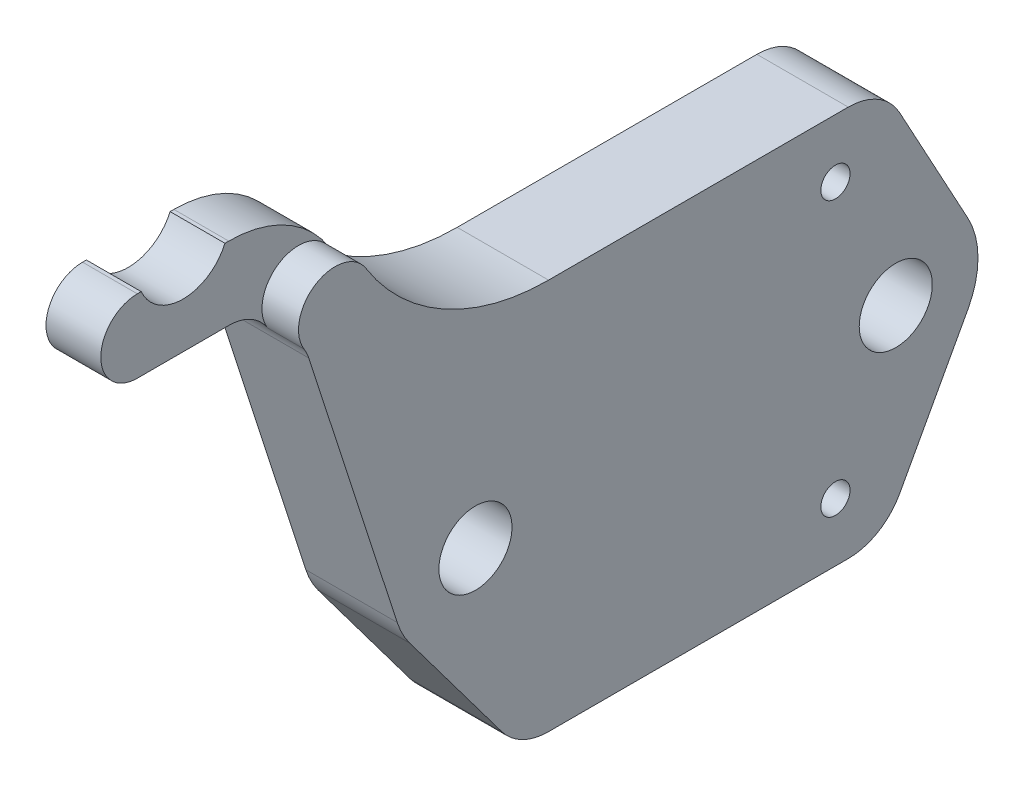
ISO-10303-21;
HEADER;
FILE_DESCRIPTION(('STEP AP214'),'2;1');
FILE_NAME('part.step','',(''),(''),'','','');
FILE_SCHEMA(('AUTOMOTIVE_DESIGN { 1 0 10303 214 1 1 1 1 }'));
ENDSEC;
DATA;
#1=APPLICATION_CONTEXT('core data for automotive mechanical design processes');
#2=APPLICATION_PROTOCOL_DEFINITION('international standard','automotive_design',2000,#1);
#3=PRODUCT_CONTEXT('',#1,'mechanical');
#4=PRODUCT('Part','Part','',(#3));
#5=PRODUCT_RELATED_PRODUCT_CATEGORY('part','',(#4));
#6=PRODUCT_DEFINITION_FORMATION('','',#4);
#7=PRODUCT_DEFINITION_CONTEXT('part definition',#1,'design');
#8=PRODUCT_DEFINITION('design','',#6,#7);
#9=PRODUCT_DEFINITION_SHAPE('','',#8);
#10=(LENGTH_UNIT() NAMED_UNIT(*) SI_UNIT(.MILLI.,.METRE.));
#11=(NAMED_UNIT(*) PLANE_ANGLE_UNIT() SI_UNIT($,.RADIAN.));
#12=(NAMED_UNIT(*) SI_UNIT($,.STERADIAN.) SOLID_ANGLE_UNIT());
#13=UNCERTAINTY_MEASURE_WITH_UNIT(LENGTH_MEASURE(1.E-05),#10,'distance_accuracy_value','');
#14=(GEOMETRIC_REPRESENTATION_CONTEXT(3) GLOBAL_UNCERTAINTY_ASSIGNED_CONTEXT((#13)) GLOBAL_UNIT_ASSIGNED_CONTEXT((#10,
#11,#12)) REPRESENTATION_CONTEXT('',''));
#15=CARTESIAN_POINT('',(0.,0.,0.));
#16=DIRECTION('',(0.,0.,1.));
#17=DIRECTION('',(1.,0.,0.));
#18=AXIS2_PLACEMENT_3D('',#15,#16,#17);
#19=CARTESIAN_POINT('',(-2.5,15.,32.5));
#20=DIRECTION('',(-1.,0.,0.));
#21=DIRECTION('',(0.,0.,-1.));
#22=AXIS2_PLACEMENT_3D('',#19,#20,#21);
#23=PLANE('',#22);
#24=CARTESIAN_POINT('',(-2.5,-4.3,4.5));
#25=DIRECTION('',(-1.,0.,0.));
#26=DIRECTION('',(0.,0.,1.));
#27=AXIS2_PLACEMENT_3D('',#24,#25,#26);
#28=CIRCLE('',#27,2.);
#29=CARTESIAN_POINT('',(-2.5,-4.3,6.5));
#30=VERTEX_POINT('',#29);
#31=EDGE_CURVE('E360',#30,#30,#28,.T.);
#32=ORIENTED_EDGE('',*,*,#31,.F.);
#33=EDGE_LOOP('',(#32));
#34=FACE_BOUND('',#33,.T.);
#35=CARTESIAN_POINT('',(-2.5,-4.3,27.5));
#36=DIRECTION('',(-1.,0.,0.));
#37=DIRECTION('',(0.,0.,1.));
#38=AXIS2_PLACEMENT_3D('',#35,#36,#37);
#39=CIRCLE('',#38,2.);
#40=CARTESIAN_POINT('',(-2.5,-4.3,29.5));
#41=VERTEX_POINT('',#40);
#42=EDGE_CURVE('E354',#41,#41,#39,.T.);
#43=ORIENTED_EDGE('',*,*,#42,.F.);
#44=EDGE_LOOP('',(#43));
#45=FACE_BOUND('',#44,.T.);
#46=CARTESIAN_POINT('',(-2.5,-11.8,7.8));
#47=DIRECTION('',(-1.,0.,0.));
#48=DIRECTION('',(0.,0.,1.));
#49=AXIS2_PLACEMENT_3D('',#46,#47,#48);
#50=CIRCLE('',#49,0.799999999999999);
#51=CARTESIAN_POINT('',(-2.5,-11.8,8.6));
#52=VERTEX_POINT('',#51);
#53=EDGE_CURVE('E350',#52,#52,#50,.T.);
#54=ORIENTED_EDGE('',*,*,#53,.F.);
#55=EDGE_LOOP('',(#54));
#56=FACE_BOUND('',#55,.T.);
#57=CARTESIAN_POINT('',(-2.5,3.2,7.8));
#58=DIRECTION('',(-1.,0.,0.));
#59=DIRECTION('',(0.,0.,1.));
#60=AXIS2_PLACEMENT_3D('',#57,#58,#59);
#61=CIRCLE('',#60,0.799999999999999);
#62=CARTESIAN_POINT('',(-2.5,3.2,8.59999999999999));
#63=VERTEX_POINT('',#62);
#64=EDGE_CURVE('E344',#63,#63,#61,.T.);
#65=ORIENTED_EDGE('',*,*,#64,.F.);
#66=EDGE_LOOP('',(#65));
#67=FACE_BOUND('',#66,.T.);
#68=DIRECTION('',(0.,0.8,0.6));
#69=VECTOR('',#68,1.);
#70=CARTESIAN_POINT('',(-2.5,-17.448,23.264));
#71=LINE('',#70,#69);
#72=CARTESIAN_POINT('',(-2.5,-13.72,26.06));
#73=VERTEX_POINT('',#72);
#74=CARTESIAN_POINT('',(-2.5,-7.,31.1));
#75=VERTEX_POINT('',#74);
#76=EDGE_CURVE('E242',#73,#75,#71,.T.);
#77=ORIENTED_EDGE('',*,*,#76,.T.);
#78=CARTESIAN_POINT('',(-2.5,-4.3,27.5));
#79=DIRECTION('',(1.,0.,0.));
#80=DIRECTION('',(0.,0.,-1.));
#81=AXIS2_PLACEMENT_3D('',#78,#79,#80);
#82=CIRCLE('',#81,4.5);
#83=CARTESIAN_POINT('',(-2.5,-5.68560320332886,31.7813670437052));
#84=VERTEX_POINT('',#83);
#85=EDGE_CURVE('E245',#84,#75,#82,.T.);
#86=ORIENTED_EDGE('',*,*,#85,.F.);
#87=DIRECTION('',(0.,0.95141489860115,0.307911822961971));
#88=VECTOR('',#87,1.);
#89=CARTESIAN_POINT('',(-2.5,-9.84946200851396,30.4337937009439));
#90=LINE('',#89,#88);
#91=CARTESIAN_POINT('',(-2.5,9.26977955740492,36.6214627534971));
#92=VERTEX_POINT('',#91);
#93=EDGE_CURVE('E231',#84,#92,#90,.T.);
#94=ORIENTED_EDGE('',*,*,#93,.T.);
#95=CARTESIAN_POINT('',(-2.5,8.5,39.));
#96=DIRECTION('',(-1.,0.,0.));
#97=DIRECTION('',(0.,0.,1.));
#98=AXIS2_PLACEMENT_3D('',#95,#96,#97);
#99=CIRCLE('',#98,2.5);
#100=CARTESIAN_POINT('',(-2.5,11.,39.));
#101=VERTEX_POINT('',#100);
#102=EDGE_CURVE('E320',#101,#92,#99,.T.);
#103=ORIENTED_EDGE('',*,*,#102,.F.);
#104=DIRECTION('',(0.,0.,-1.));
#105=VECTOR('',#104,1.);
#106=CARTESIAN_POINT('',(-2.5,11.,44.));
#107=LINE('',#106,#105);
#108=CARTESIAN_POINT('',(-2.5,11.,44.));
#109=VERTEX_POINT('',#108);
#110=EDGE_CURVE('E323',#109,#101,#107,.T.);
#111=ORIENTED_EDGE('',*,*,#110,.F.);
#112=CARTESIAN_POINT('',(-2.5,13.,44.));
#113=DIRECTION('',(1.,0.,0.));
#114=DIRECTION('',(0.,0.,-1.));
#115=AXIS2_PLACEMENT_3D('',#112,#113,#114);
#116=CIRCLE('',#115,2.);
#117=CARTESIAN_POINT('',(-2.5,15.,44.));
#118=VERTEX_POINT('',#117);
#119=EDGE_CURVE('E326',#118,#109,#116,.T.);
#120=ORIENTED_EDGE('',*,*,#119,.F.);
#121=DIRECTION('',(0.,0.,1.));
#122=VECTOR('',#121,1.);
#123=CARTESIAN_POINT('',(-2.5,15.,43.7912878474779));
#124=LINE('',#123,#122);
#125=CARTESIAN_POINT('',(-2.5,15.,43.7912878474779));
#126=VERTEX_POINT('',#125);
#127=EDGE_CURVE('E329',#126,#118,#124,.T.);
#128=ORIENTED_EDGE('',*,*,#127,.F.);
#129=CARTESIAN_POINT('',(-2.5,16.,41.5));
#130=DIRECTION('',(-1.,0.,0.));
#131=DIRECTION('',(0.,0.,-1.));
#132=AXIS2_PLACEMENT_3D('',#129,#130,#131);
#133=CIRCLE('',#132,2.5);
#134=CARTESIAN_POINT('',(-2.5,15.,39.2087121525221));
#135=VERTEX_POINT('',#134);
#136=EDGE_CURVE('E309',#135,#126,#133,.T.);
#137=ORIENTED_EDGE('',*,*,#136,.F.);
#138=DIRECTION('',(0.,0.,-1.));
#139=VECTOR('',#138,1.);
#140=CARTESIAN_POINT('',(-2.5,15.,32.5));
#141=LINE('',#140,#139);
#142=CARTESIAN_POINT('',(-2.5,15.,39.));
#143=VERTEX_POINT('',#142);
#144=EDGE_CURVE('E11',#135,#143,#141,.T.);
#145=ORIENTED_EDGE('',*,*,#144,.T.);
#146=CARTESIAN_POINT('',(-2.5,8.5,39.));
#147=DIRECTION('',(1.,0.,0.));
#148=DIRECTION('',(0.,0.,-1.));
#149=AXIS2_PLACEMENT_3D('',#146,#147,#148);
#150=CIRCLE('',#149,6.5);
#151=CARTESIAN_POINT('',(-2.5,11.9400082747207,33.4848986346711));
#152=VERTEX_POINT('',#151);
#153=EDGE_CURVE('E279',#152,#143,#150,.T.);
#154=ORIENTED_EDGE('',*,*,#153,.F.);
#155=CARTESIAN_POINT('',(-2.5,18.168023255814,23.5));
#156=DIRECTION('',(1.,0.,0.));
#157=DIRECTION('',(0.,0.,-1.));
#158=AXIS2_PLACEMENT_3D('',#155,#156,#157);
#159=CIRCLE('',#158,11.768023255814);
#160=CARTESIAN_POINT('',(-2.5,6.39999999999999,23.5));
#161=VERTEX_POINT('',#160);
#162=EDGE_CURVE('E270',#161,#152,#159,.F.);
#163=ORIENTED_EDGE('',*,*,#162,.F.);
#164=DIRECTION('',(0.,0.,1.));
#165=VECTOR('',#164,1.);
#166=CARTESIAN_POINT('',(-2.5,6.39999999999999,0.));
#167=LINE('',#166,#165);
#168=CARTESIAN_POINT('',(-2.5,6.39999999999999,7.1));
#169=VERTEX_POINT('',#168);
#170=EDGE_CURVE('E293',#169,#161,#167,.T.);
#171=ORIENTED_EDGE('',*,*,#170,.F.);
#172=CARTESIAN_POINT('',(-2.5,3.2,7.1));
#173=DIRECTION('',(1.,0.,0.));
#174=DIRECTION('',(0.,0.,-1.));
#175=AXIS2_PLACEMENT_3D('',#172,#173,#174);
#176=CIRCLE('',#175,3.2);
#177=CARTESIAN_POINT('',(-2.5,4.72914612047459,4.28900157555407));
#178=VERTEX_POINT('',#177);
#179=EDGE_CURVE('E296',#178,#169,#176,.T.);
#180=ORIENTED_EDGE('',*,*,#179,.F.);
#181=DIRECTION('',(0.,0.878437007639354,0.477858162648309));
#182=VECTOR('',#181,1.);
#183=CARTESIAN_POINT('',(-2.5,-0.720493814731657,1.32446922561275));
#184=LINE('',#183,#182);
#185=CARTESIAN_POINT('',(-2.5,-2.14963826808261,0.547033465622908));
#186=VERTEX_POINT('',#185);
#187=EDGE_CURVE('E299',#186,#178,#184,.T.);
#188=ORIENTED_EDGE('',*,*,#187,.F.);
#189=CARTESIAN_POINT('',(-2.5,-4.3,4.5));
#190=DIRECTION('',(1.,0.,0.));
#191=DIRECTION('',(0.,0.,-1.));
#192=AXIS2_PLACEMENT_3D('',#189,#190,#191);
#193=CIRCLE('',#192,4.5);
#194=CARTESIAN_POINT('',(-2.5,-6.45036173191739,0.547033465622908));
#195=VERTEX_POINT('',#194);
#196=EDGE_CURVE('E302',#195,#186,#193,.T.);
#197=ORIENTED_EDGE('',*,*,#196,.F.);
#198=DIRECTION('',(0.,-0.878437007639354,0.477858162648309));
#199=VECTOR('',#198,1.);
#200=CARTESIAN_POINT('',(-2.5,-1.24330262831106,-2.2855381068535));
#201=LINE('',#200,#199);
#202=CARTESIAN_POINT('',(-2.5,-13.3291461204746,4.28900157555407));
#203=VERTEX_POINT('',#202);
#204=EDGE_CURVE('E267',#195,#203,#201,.T.);
#205=ORIENTED_EDGE('',*,*,#204,.T.);
#206=CARTESIAN_POINT('',(-2.5,-11.8,7.1));
#207=DIRECTION('',(1.,0.,0.));
#208=DIRECTION('',(0.,0.,-1.));
#209=AXIS2_PLACEMENT_3D('',#206,#207,#208);
#210=CIRCLE('',#209,3.2);
#211=CARTESIAN_POINT('',(-2.5,-15.,7.1));
#212=VERTEX_POINT('',#211);
#213=EDGE_CURVE('E252',#212,#203,#210,.T.);
#214=ORIENTED_EDGE('',*,*,#213,.F.);
#215=DIRECTION('',(0.,0.,-1.));
#216=VECTOR('',#215,1.);
#217=CARTESIAN_POINT('',(-2.5,-15.,32.5));
#218=LINE('',#217,#216);
#219=CARTESIAN_POINT('',(-2.5,-15.,23.5));
#220=VERTEX_POINT('',#219);
#221=EDGE_CURVE('E42',#220,#212,#218,.T.);
#222=ORIENTED_EDGE('',*,*,#221,.F.);
#223=CARTESIAN_POINT('',(-2.5,-11.8,23.5));
#224=DIRECTION('',(1.,0.,0.));
#225=DIRECTION('',(0.,0.,-1.));
#226=AXIS2_PLACEMENT_3D('',#223,#224,#225);
#227=CIRCLE('',#226,3.2);
#228=EDGE_CURVE('E192',#73,#220,#227,.T.);
#229=ORIENTED_EDGE('',*,*,#228,.F.);
#230=EDGE_LOOP('',(#77,#86,#94,#103,#111,#120,#128,#137,#145,#154,#163,#171,#180,#188,#197,#205,
#214,#222,#229));
#231=FACE_BOUND('',#230,.T.);
#232=ADVANCED_FACE('F39',(#34,#45,#56,#67,#231),#23,.T.);
#233=CARTESIAN_POINT('',(2.5,15.,32.5));
#234=DIRECTION('',(1.,0.,0.));
#235=DIRECTION('',(0.,0.,1.));
#236=AXIS2_PLACEMENT_3D('',#233,#234,#235);
#237=PLANE('',#236);
#238=CARTESIAN_POINT('',(2.5,10.8815441901913,35.1818529009261));
#239=DIRECTION('',(1.,0.,0.));
#240=DIRECTION('',(0.,0.,-1.));
#241=AXIS2_PLACEMENT_3D('',#238,#239,#240);
#242=CIRCLE('',#241,2.);
#243=CARTESIAN_POINT('',(2.5,9.82308010566182,36.8788071671812));
#244=VERTEX_POINT('',#243);
#245=CARTESIAN_POINT('',(2.5,11.9400082747207,33.4848986346711));
#246=VERTEX_POINT('',#245);
#247=EDGE_CURVE('E187',#244,#246,#242,.F.);
#248=ORIENTED_EDGE('',*,*,#247,.F.);
#249=CARTESIAN_POINT('',(2.5,8.5,39.));
#250=DIRECTION('',(-1.,0.,0.));
#251=DIRECTION('',(0.,0.,1.));
#252=AXIS2_PLACEMENT_3D('',#249,#250,#251);
#253=CIRCLE('',#252,2.5);
#254=CARTESIAN_POINT('',(2.5,9.26977955740492,36.6214627534971));
#255=VERTEX_POINT('',#254);
#256=EDGE_CURVE('E195',#244,#255,#253,.T.);
#257=ORIENTED_EDGE('',*,*,#256,.T.);
#258=DIRECTION('',(0.,0.95141489860115,0.307911822961971));
#259=VECTOR('',#258,1.);
#260=CARTESIAN_POINT('',(2.5,-9.84946200851396,30.4337937009439));
#261=LINE('',#260,#259);
#262=CARTESIAN_POINT('',(2.5,-5.68560320332886,31.7813670437052));
#263=VERTEX_POINT('',#262);
#264=EDGE_CURVE('E237',#263,#255,#261,.T.);
#265=ORIENTED_EDGE('',*,*,#264,.F.);
#266=CARTESIAN_POINT('',(2.5,-4.3,27.5));
#267=DIRECTION('',(1.,0.,0.));
#268=DIRECTION('',(0.,0.,-1.));
#269=AXIS2_PLACEMENT_3D('',#266,#267,#268);
#270=CIRCLE('',#269,4.5);
#271=CARTESIAN_POINT('',(2.5,-7.,31.1));
#272=VERTEX_POINT('',#271);
#273=EDGE_CURVE('E234',#263,#272,#270,.T.);
#274=ORIENTED_EDGE('',*,*,#273,.T.);
#275=DIRECTION('',(0.,0.8,0.6));
#276=VECTOR('',#275,1.);
#277=CARTESIAN_POINT('',(2.5,-17.448,23.264));
#278=LINE('',#277,#276);
#279=CARTESIAN_POINT('',(2.5,-13.72,26.06));
#280=VERTEX_POINT('',#279);
#281=EDGE_CURVE('E230',#280,#272,#278,.T.);
#282=ORIENTED_EDGE('',*,*,#281,.F.);
#283=CARTESIAN_POINT('',(2.5,-11.8,23.5));
#284=DIRECTION('',(1.,0.,0.));
#285=DIRECTION('',(0.,0.,-1.));
#286=AXIS2_PLACEMENT_3D('',#283,#284,#285);
#287=CIRCLE('',#286,3.2);
#288=CARTESIAN_POINT('',(2.5,-15.,23.5));
#289=VERTEX_POINT('',#288);
#290=EDGE_CURVE('E227',#280,#289,#287,.T.);
#291=ORIENTED_EDGE('',*,*,#290,.T.);
#292=DIRECTION('',(0.,0.,-1.));
#293=VECTOR('',#292,1.);
#294=CARTESIAN_POINT('',(2.5,-15.,32.5));
#295=LINE('',#294,#293);
#296=CARTESIAN_POINT('',(2.5,-15.,7.1));
#297=VERTEX_POINT('',#296);
#298=EDGE_CURVE('E47',#289,#297,#295,.T.);
#299=ORIENTED_EDGE('',*,*,#298,.T.);
#300=CARTESIAN_POINT('',(2.5,-11.8,7.1));
#301=DIRECTION('',(1.,0.,0.));
#302=DIRECTION('',(0.,0.,-1.));
#303=AXIS2_PLACEMENT_3D('',#300,#301,#302);
#304=CIRCLE('',#303,3.2);
#305=CARTESIAN_POINT('',(2.5,-13.3291461204746,4.28900157555407));
#306=VERTEX_POINT('',#305);
#307=EDGE_CURVE('E264',#297,#306,#304,.T.);
#308=ORIENTED_EDGE('',*,*,#307,.T.);
#309=DIRECTION('',(0.,-0.878437007639354,0.477858162648309));
#310=VECTOR('',#309,1.);
#311=CARTESIAN_POINT('',(2.5,-1.24330262831106,-2.2855381068535));
#312=LINE('',#311,#310);
#313=CARTESIAN_POINT('',(2.5,-6.45036173191739,0.547033465622908));
#314=VERTEX_POINT('',#313);
#315=EDGE_CURVE('E261',#314,#306,#312,.T.);
#316=ORIENTED_EDGE('',*,*,#315,.F.);
#317=CARTESIAN_POINT('',(2.5,-4.3,4.5));
#318=DIRECTION('',(1.,0.,0.));
#319=DIRECTION('',(0.,0.,-1.));
#320=AXIS2_PLACEMENT_3D('',#317,#318,#319);
#321=CIRCLE('',#320,4.5);
#322=CARTESIAN_POINT('',(2.5,-2.14963826808261,0.547033465622908));
#323=VERTEX_POINT('',#322);
#324=EDGE_CURVE('E287',#314,#323,#321,.T.);
#325=ORIENTED_EDGE('',*,*,#324,.T.);
#326=DIRECTION('',(0.,0.878437007639354,0.477858162648309));
#327=VECTOR('',#326,1.);
#328=CARTESIAN_POINT('',(2.5,-0.720493814731657,1.32446922561275));
#329=LINE('',#328,#327);
#330=CARTESIAN_POINT('',(2.5,4.72914612047459,4.28900157555407));
#331=VERTEX_POINT('',#330);
#332=EDGE_CURVE('E284',#323,#331,#329,.T.);
#333=ORIENTED_EDGE('',*,*,#332,.T.);
#334=CARTESIAN_POINT('',(2.5,3.2,7.1));
#335=DIRECTION('',(1.,0.,0.));
#336=DIRECTION('',(0.,0.,-1.));
#337=AXIS2_PLACEMENT_3D('',#334,#335,#336);
#338=CIRCLE('',#337,3.2);
#339=CARTESIAN_POINT('',(2.5,6.39999999999999,7.1));
#340=VERTEX_POINT('',#339);
#341=EDGE_CURVE('E281',#331,#340,#338,.T.);
#342=ORIENTED_EDGE('',*,*,#341,.T.);
#343=DIRECTION('',(0.,0.,1.));
#344=VECTOR('',#343,1.);
#345=CARTESIAN_POINT('',(2.5,6.39999999999999,0.));
#346=LINE('',#345,#344);
#347=CARTESIAN_POINT('',(2.5,6.39999999999999,23.5));
#348=VERTEX_POINT('',#347);
#349=EDGE_CURVE('E278',#340,#348,#346,.T.);
#350=ORIENTED_EDGE('',*,*,#349,.T.);
#351=CARTESIAN_POINT('',(2.5,18.168023255814,23.5));
#352=DIRECTION('',(1.,0.,0.));
#353=DIRECTION('',(0.,0.,-1.));
#354=AXIS2_PLACEMENT_3D('',#351,#352,#353);
#355=CIRCLE('',#354,11.768023255814);
#356=EDGE_CURVE('E207',#348,#246,#355,.F.);
#357=ORIENTED_EDGE('',*,*,#356,.T.);
#358=EDGE_LOOP('',(#248,#257,#265,#274,#282,#291,#299,#308,#316,#325,#333,#342,#350,#357));
#359=FACE_BOUND('',#358,.T.);
#360=CARTESIAN_POINT('',(2.5,-4.3,4.5));
#361=DIRECTION('',(-1.,0.,0.));
#362=DIRECTION('',(0.,0.,1.));
#363=AXIS2_PLACEMENT_3D('',#360,#361,#362);
#364=CIRCLE('',#363,2.);
#365=CARTESIAN_POINT('',(2.5,-4.3,6.5));
#366=VERTEX_POINT('',#365);
#367=EDGE_CURVE('E357',#366,#366,#364,.T.);
#368=ORIENTED_EDGE('',*,*,#367,.T.);
#369=EDGE_LOOP('',(#368));
#370=FACE_BOUND('',#369,.T.);
#371=CARTESIAN_POINT('',(2.5,-4.3,27.5));
#372=DIRECTION('',(-1.,0.,0.));
#373=DIRECTION('',(0.,0.,1.));
#374=AXIS2_PLACEMENT_3D('',#371,#372,#373);
#375=CIRCLE('',#374,2.);
#376=CARTESIAN_POINT('',(2.5,-4.3,29.5));
#377=VERTEX_POINT('',#376);
#378=EDGE_CURVE('E353',#377,#377,#375,.T.);
#379=ORIENTED_EDGE('',*,*,#378,.T.);
#380=EDGE_LOOP('',(#379));
#381=FACE_BOUND('',#380,.T.);
#382=CARTESIAN_POINT('',(2.5,-11.8,7.8));
#383=DIRECTION('',(-1.,0.,0.));
#384=DIRECTION('',(0.,0.,1.));
#385=AXIS2_PLACEMENT_3D('',#382,#383,#384);
#386=CIRCLE('',#385,0.799999999999988);
#387=CARTESIAN_POINT('',(2.5,-11.8,8.59999999999999));
#388=VERTEX_POINT('',#387);
#389=EDGE_CURVE('E347',#388,#388,#386,.T.);
#390=ORIENTED_EDGE('',*,*,#389,.T.);
#391=EDGE_LOOP('',(#390));
#392=FACE_BOUND('',#391,.T.);
#393=CARTESIAN_POINT('',(2.5,3.2,7.8));
#394=DIRECTION('',(-1.,0.,0.));
#395=DIRECTION('',(0.,0.,1.));
#396=AXIS2_PLACEMENT_3D('',#393,#394,#395);
#397=CIRCLE('',#396,0.799999999999988);
#398=CARTESIAN_POINT('',(2.5,3.2,8.59999999999998));
#399=VERTEX_POINT('',#398);
#400=EDGE_CURVE('E199',#399,#399,#397,.T.);
#401=ORIENTED_EDGE('',*,*,#400,.T.);
#402=EDGE_LOOP('',(#401));
#403=FACE_BOUND('',#402,.T.);
#404=ADVANCED_FACE('F203',(#359,#370,#381,#392,#403),#237,.T.);
#405=CARTESIAN_POINT('',(35.397568299192,8.5,39.));
#406=DIRECTION('',(-1.,0.,0.));
#407=DIRECTION('',(0.,0.,-1.));
#408=AXIS2_PLACEMENT_3D('',#405,#406,#407);
#409=CYLINDRICAL_SURFACE('',#408,2.5);
#410=DIRECTION('',(-1.,0.,0.));
#411=VECTOR('',#410,1.);
#412=CARTESIAN_POINT('',(2.5,9.82308010566182,36.8788071671812));
#413=LINE('',#412,#411);
#414=CARTESIAN_POINT('',(0.5,9.82308010566182,36.8788071671812));
#415=VERTEX_POINT('',#414);
#416=EDGE_CURVE('E182',#244,#415,#413,.T.);
#417=ORIENTED_EDGE('',*,*,#416,.T.);
#418=CARTESIAN_POINT('',(0.5,8.5,39.));
#419=DIRECTION('',(1.,0.,0.));
#420=DIRECTION('',(0.,0.,-1.));
#421=AXIS2_PLACEMENT_3D('',#418,#419,#420);
#422=CIRCLE('',#421,2.5);
#423=CARTESIAN_POINT('',(0.5,11.,39.));
#424=VERTEX_POINT('',#423);
#425=EDGE_CURVE('E213',#424,#415,#422,.F.);
#426=ORIENTED_EDGE('',*,*,#425,.F.);
#427=DIRECTION('',(-1.,0.,0.));
#428=VECTOR('',#427,1.);
#429=CARTESIAN_POINT('',(35.397568299192,11.,39.));
#430=LINE('',#429,#428);
#431=EDGE_CURVE('E200',#424,#101,#430,.T.);
#432=ORIENTED_EDGE('',*,*,#431,.T.);
#433=ORIENTED_EDGE('',*,*,#102,.T.);
#434=DIRECTION('',(-1.,0.,0.));
#435=VECTOR('',#434,1.);
#436=CARTESIAN_POINT('',(2.5,9.26977955740492,36.6214627534971));
#437=LINE('',#436,#435);
#438=EDGE_CURVE('E63',#255,#92,#437,.T.);
#439=ORIENTED_EDGE('',*,*,#438,.F.);
#440=ORIENTED_EDGE('',*,*,#256,.F.);
#441=EDGE_LOOP('',(#417,#426,#432,#433,#439,#440));
#442=FACE_BOUND('',#441,.T.);
#443=ADVANCED_FACE('F196',(#442),#409,.F.);
#444=CARTESIAN_POINT('',(-2.5,-15.,32.5));
#445=DIRECTION('',(0.,-1.,0.));
#446=DIRECTION('',(0.,0.,1.));
#447=AXIS2_PLACEMENT_3D('',#444,#445,#446);
#448=PLANE('',#447);
#449=DIRECTION('',(-1.,0.,0.));
#450=VECTOR('',#449,1.);
#451=CARTESIAN_POINT('',(2.5,-15.,23.5));
#452=LINE('',#451,#450);
#453=EDGE_CURVE('E250',#289,#220,#452,.T.);
#454=ORIENTED_EDGE('',*,*,#453,.T.);
#455=ORIENTED_EDGE('',*,*,#221,.T.);
#456=DIRECTION('',(-1.,0.,0.));
#457=VECTOR('',#456,1.);
#458=CARTESIAN_POINT('',(2.5,-15.,7.1));
#459=LINE('',#458,#457);
#460=EDGE_CURVE('E259',#297,#212,#459,.T.);
#461=ORIENTED_EDGE('',*,*,#460,.F.);
#462=ORIENTED_EDGE('',*,*,#298,.F.);
#463=EDGE_LOOP('',(#454,#455,#461,#462));
#464=FACE_BOUND('',#463,.T.);
#465=ADVANCED_FACE('F370',(#464),#448,.T.);
#466=CARTESIAN_POINT('',(-2.5,15.,32.5));
#467=DIRECTION('',(0.,1.,0.));
#468=DIRECTION('',(0.,0.,-1.));
#469=AXIS2_PLACEMENT_3D('',#466,#467,#468);
#470=PLANE('',#469);
#471=DIRECTION('',(0.,0.,1.));
#472=VECTOR('',#471,1.);
#473=CARTESIAN_POINT('',(0.5,15.,0.));
#474=LINE('',#473,#472);
#475=CARTESIAN_POINT('',(0.5,15.,39.));
#476=VERTEX_POINT('',#475);
#477=CARTESIAN_POINT('',(0.5,15.,39.2087121525221));
#478=VERTEX_POINT('',#477);
#479=EDGE_CURVE('E217',#476,#478,#474,.T.);
#480=ORIENTED_EDGE('',*,*,#479,.F.);
#481=DIRECTION('',(-1.,0.,0.));
#482=VECTOR('',#481,1.);
#483=CARTESIAN_POINT('',(2.5,15.,39.));
#484=LINE('',#483,#482);
#485=EDGE_CURVE('E311',#476,#143,#484,.T.);
#486=ORIENTED_EDGE('',*,*,#485,.T.);
#487=ORIENTED_EDGE('',*,*,#144,.F.);
#488=DIRECTION('',(-1.,0.,0.));
#489=VECTOR('',#488,1.);
#490=CARTESIAN_POINT('',(35.397568299192,15.,39.2087121525221));
#491=LINE('',#490,#489);
#492=EDGE_CURVE('E322',#478,#135,#491,.T.);
#493=ORIENTED_EDGE('',*,*,#492,.F.);
#494=EDGE_LOOP('',(#480,#486,#487,#493));
#495=FACE_BOUND('',#494,.T.);
#496=ADVANCED_FACE('F407',(#495),#470,.T.);
#497=CARTESIAN_POINT('',(-2.5,-4.3,4.5));
#498=DIRECTION('',(1.,0.,0.));
#499=DIRECTION('',(0.,0.,1.));
#500=AXIS2_PLACEMENT_3D('',#497,#498,#499);
#501=CYLINDRICAL_SURFACE('',#500,2.);
#502=ORIENTED_EDGE('',*,*,#31,.T.);
#503=EDGE_LOOP('',(#502));
#504=FACE_BOUND('',#503,.T.);
#505=ORIENTED_EDGE('',*,*,#367,.F.);
#506=EDGE_LOOP('',(#505));
#507=FACE_BOUND('',#506,.T.);
#508=ADVANCED_FACE('F481',(#504,#507),#501,.F.);
#509=CARTESIAN_POINT('',(-2.5,-4.3,27.5));
#510=DIRECTION('',(1.,0.,0.));
#511=DIRECTION('',(0.,0.,1.));
#512=AXIS2_PLACEMENT_3D('',#509,#510,#511);
#513=CYLINDRICAL_SURFACE('',#512,2.);
#514=ORIENTED_EDGE('',*,*,#42,.T.);
#515=EDGE_LOOP('',(#514));
#516=FACE_BOUND('',#515,.T.);
#517=ORIENTED_EDGE('',*,*,#378,.F.);
#518=EDGE_LOOP('',(#517));
#519=FACE_BOUND('',#518,.T.);
#520=ADVANCED_FACE('F474',(#516,#519),#513,.F.);
#521=CARTESIAN_POINT('',(2.5,-11.8,7.8));
#522=DIRECTION('',(1.,0.,0.));
#523=DIRECTION('',(0.,0.,1.));
#524=AXIS2_PLACEMENT_3D('',#521,#522,#523);
#525=CYLINDRICAL_SURFACE('',#524,0.799999999999993);
#526=ORIENTED_EDGE('',*,*,#53,.T.);
#527=EDGE_LOOP('',(#526));
#528=FACE_BOUND('',#527,.T.);
#529=ORIENTED_EDGE('',*,*,#389,.F.);
#530=EDGE_LOOP('',(#529));
#531=FACE_BOUND('',#530,.T.);
#532=ADVANCED_FACE('F465',(#528,#531),#525,.F.);
#533=CARTESIAN_POINT('',(2.5,3.2,7.8));
#534=DIRECTION('',(1.,0.,0.));
#535=DIRECTION('',(0.,0.,1.));
#536=AXIS2_PLACEMENT_3D('',#533,#534,#535);
#537=CYLINDRICAL_SURFACE('',#536,0.799999999999993);
#538=ORIENTED_EDGE('',*,*,#64,.T.);
#539=EDGE_LOOP('',(#538));
#540=FACE_BOUND('',#539,.T.);
#541=ORIENTED_EDGE('',*,*,#400,.F.);
#542=EDGE_LOOP('',(#541));
#543=FACE_BOUND('',#542,.T.);
#544=ADVANCED_FACE('F462',(#540,#543),#537,.F.);
#545=CARTESIAN_POINT('',(35.397568299192,16.,41.5));
#546=DIRECTION('',(-1.,0.,0.));
#547=DIRECTION('',(0.,0.,-1.));
#548=AXIS2_PLACEMENT_3D('',#545,#546,#547);
#549=CYLINDRICAL_SURFACE('',#548,2.5);
#550=CARTESIAN_POINT('',(0.5,16.,41.5));
#551=DIRECTION('',(1.,0.,0.));
#552=DIRECTION('',(0.,0.,-1.));
#553=AXIS2_PLACEMENT_3D('',#550,#551,#552);
#554=CIRCLE('',#553,2.5);
#555=CARTESIAN_POINT('',(0.5,15.,43.7912878474779));
#556=VERTEX_POINT('',#555);
#557=EDGE_CURVE('E219',#478,#556,#554,.F.);
#558=ORIENTED_EDGE('',*,*,#557,.F.);
#559=ORIENTED_EDGE('',*,*,#492,.T.);
#560=ORIENTED_EDGE('',*,*,#136,.T.);
#561=DIRECTION('',(-1.,0.,0.));
#562=VECTOR('',#561,1.);
#563=CARTESIAN_POINT('',(35.397568299192,15.,43.7912878474779));
#564=LINE('',#563,#562);
#565=EDGE_CURVE('E339',#556,#126,#564,.T.);
#566=ORIENTED_EDGE('',*,*,#565,.F.);
#567=EDGE_LOOP('',(#558,#559,#560,#566));
#568=FACE_BOUND('',#567,.T.);
#569=ADVANCED_FACE('F411',(#568),#549,.F.);
#570=CARTESIAN_POINT('',(35.397568299192,15.,43.7912878474779));
#571=DIRECTION('',(0.,1.,0.));
#572=DIRECTION('',(0.,0.,-1.));
#573=AXIS2_PLACEMENT_3D('',#570,#571,#572);
#574=PLANE('',#573);
#575=DIRECTION('',(0.,0.,1.));
#576=VECTOR('',#575,1.);
#577=CARTESIAN_POINT('',(0.5,15.0000000000004,1.24673392637739E-13));
#578=LINE('',#577,#576);
#579=CARTESIAN_POINT('',(0.5,15.,44.));
#580=VERTEX_POINT('',#579);
#581=EDGE_CURVE('E222',#556,#580,#578,.T.);
#582=ORIENTED_EDGE('',*,*,#581,.F.);
#583=ORIENTED_EDGE('',*,*,#565,.T.);
#584=ORIENTED_EDGE('',*,*,#127,.T.);
#585=DIRECTION('',(-1.,0.,0.));
#586=VECTOR('',#585,1.);
#587=CARTESIAN_POINT('',(35.397568299192,15.,44.));
#588=LINE('',#587,#586);
#589=EDGE_CURVE('E337',#580,#118,#588,.T.);
#590=ORIENTED_EDGE('',*,*,#589,.F.);
#591=EDGE_LOOP('',(#582,#583,#584,#590));
#592=FACE_BOUND('',#591,.T.);
#593=ADVANCED_FACE('F415',(#592),#574,.T.);
#594=CARTESIAN_POINT('',(35.397568299192,13.,44.));
#595=DIRECTION('',(-1.,0.,0.));
#596=DIRECTION('',(0.,0.,-1.));
#597=AXIS2_PLACEMENT_3D('',#594,#595,#596);
#598=CYLINDRICAL_SURFACE('',#597,2.);
#599=CARTESIAN_POINT('',(0.5,13.,44.));
#600=DIRECTION('',(1.,0.,0.));
#601=DIRECTION('',(0.,0.,-1.));
#602=AXIS2_PLACEMENT_3D('',#599,#600,#601);
#603=CIRCLE('',#602,2.);
#604=CARTESIAN_POINT('',(0.5,11.,44.));
#605=VERTEX_POINT('',#604);
#606=EDGE_CURVE('E210',#580,#605,#603,.T.);
#607=ORIENTED_EDGE('',*,*,#606,.F.);
#608=ORIENTED_EDGE('',*,*,#589,.T.);
#609=ORIENTED_EDGE('',*,*,#119,.T.);
#610=DIRECTION('',(-1.,0.,0.));
#611=VECTOR('',#610,1.);
#612=CARTESIAN_POINT('',(35.397568299192,11.,44.));
#613=LINE('',#612,#611);
#614=EDGE_CURVE('E335',#605,#109,#613,.T.);
#615=ORIENTED_EDGE('',*,*,#614,.F.);
#616=EDGE_LOOP('',(#607,#608,#609,#615));
#617=FACE_BOUND('',#616,.T.);
#618=ADVANCED_FACE('F419',(#617),#598,.T.);
#619=CARTESIAN_POINT('',(35.397568299192,11.,44.));
#620=DIRECTION('',(0.,-1.,0.));
#621=DIRECTION('',(0.,0.,1.));
#622=AXIS2_PLACEMENT_3D('',#619,#620,#621);
#623=PLANE('',#622);
#624=DIRECTION('',(0.,0.,-1.));
#625=VECTOR('',#624,1.);
#626=CARTESIAN_POINT('',(0.5,11.,0.));
#627=LINE('',#626,#625);
#628=EDGE_CURVE('E208',#605,#424,#627,.T.);
#629=ORIENTED_EDGE('',*,*,#628,.F.);
#630=ORIENTED_EDGE('',*,*,#614,.T.);
#631=ORIENTED_EDGE('',*,*,#110,.T.);
#632=ORIENTED_EDGE('',*,*,#431,.F.);
#633=EDGE_LOOP('',(#629,#630,#631,#632));
#634=FACE_BOUND('',#633,.T.);
#635=ADVANCED_FACE('F424',(#634),#623,.T.);
#636=CARTESIAN_POINT('',(2.5,18.168023255814,23.5));
#637=DIRECTION('',(-1.,0.,0.));
#638=DIRECTION('',(0.,0.,-1.));
#639=AXIS2_PLACEMENT_3D('',#636,#637,#638);
#640=CYLINDRICAL_SURFACE('',#639,11.768023255814);
#641=ORIENTED_EDGE('',*,*,#162,.T.);
#642=DIRECTION('',(-1.,0.,0.));
#643=VECTOR('',#642,1.);
#644=CARTESIAN_POINT('',(2.5,11.9400082747207,33.4848986346711));
#645=LINE('',#644,#643);
#646=CARTESIAN_POINT('',(0.5,11.9400082747207,33.4848986346711));
#647=VERTEX_POINT('',#646);
#648=EDGE_CURVE('E310',#647,#152,#645,.T.);
#649=ORIENTED_EDGE('',*,*,#648,.F.);
#650=EDGE_CURVE('E307',#246,#647,#645,.T.);
#651=ORIENTED_EDGE('',*,*,#650,.F.);
#652=ORIENTED_EDGE('',*,*,#356,.F.);
#653=DIRECTION('',(-1.,0.,0.));
#654=VECTOR('',#653,1.);
#655=CARTESIAN_POINT('',(2.5,6.39999999999999,23.5));
#656=LINE('',#655,#654);
#657=EDGE_CURVE('E290',#348,#161,#656,.T.);
#658=ORIENTED_EDGE('',*,*,#657,.T.);
#659=EDGE_LOOP('',(#641,#649,#651,#652,#658));
#660=FACE_BOUND('',#659,.T.);
#661=ADVANCED_FACE('F398',(#660),#640,.F.);
#662=CARTESIAN_POINT('',(2.5,8.5,39.));
#663=DIRECTION('',(-1.,0.,0.));
#664=DIRECTION('',(0.,0.,-1.));
#665=AXIS2_PLACEMENT_3D('',#662,#663,#664);
#666=CYLINDRICAL_SURFACE('',#665,6.5);
#667=CARTESIAN_POINT('',(0.5,8.5,39.));
#668=DIRECTION('',(1.,0.,0.));
#669=DIRECTION('',(0.,0.,-1.));
#670=AXIS2_PLACEMENT_3D('',#667,#668,#669);
#671=CIRCLE('',#670,6.5);
#672=EDGE_CURVE('E55',#647,#476,#671,.T.);
#673=ORIENTED_EDGE('',*,*,#672,.F.);
#674=ORIENTED_EDGE('',*,*,#648,.T.);
#675=ORIENTED_EDGE('',*,*,#153,.T.);
#676=ORIENTED_EDGE('',*,*,#485,.F.);
#677=EDGE_LOOP('',(#673,#674,#675,#676));
#678=FACE_BOUND('',#677,.T.);
#679=ADVANCED_FACE('F402',(#678),#666,.T.);
#680=CARTESIAN_POINT('',(2.5,-4.3,4.5));
#681=DIRECTION('',(-1.,0.,0.));
#682=DIRECTION('',(0.,0.,-1.));
#683=AXIS2_PLACEMENT_3D('',#680,#681,#682);
#684=CYLINDRICAL_SURFACE('',#683,4.5);
#685=ORIENTED_EDGE('',*,*,#196,.T.);
#686=DIRECTION('',(-1.,0.,0.));
#687=VECTOR('',#686,1.);
#688=CARTESIAN_POINT('',(2.5,-2.14963826808261,0.547033465622908));
#689=LINE('',#688,#687);
#690=EDGE_CURVE('E313',#323,#186,#689,.T.);
#691=ORIENTED_EDGE('',*,*,#690,.F.);
#692=ORIENTED_EDGE('',*,*,#324,.F.);
#693=DIRECTION('',(-1.,0.,0.));
#694=VECTOR('',#693,1.);
#695=CARTESIAN_POINT('',(2.5,-6.45036173191739,0.547033465622908));
#696=LINE('',#695,#694);
#697=EDGE_CURVE('E262',#314,#195,#696,.T.);
#698=ORIENTED_EDGE('',*,*,#697,.T.);
#699=EDGE_LOOP('',(#685,#691,#692,#698));
#700=FACE_BOUND('',#699,.T.);
#701=ADVANCED_FACE('F383',(#700),#684,.T.);
#702=CARTESIAN_POINT('',(2.5,-0.720493814731657,1.32446922561275));
#703=DIRECTION('',(0.,0.477858162648309,-0.878437007639354));
#704=DIRECTION('',(0.,-0.878437007639354,-0.47785816264831));
#705=AXIS2_PLACEMENT_3D('',#702,#703,#704);
#706=PLANE('',#705);
#707=ORIENTED_EDGE('',*,*,#187,.T.);
#708=DIRECTION('',(-1.,0.,0.));
#709=VECTOR('',#708,1.);
#710=CARTESIAN_POINT('',(2.5,4.72914612047459,4.28900157555407));
#711=LINE('',#710,#709);
#712=EDGE_CURVE('E315',#331,#178,#711,.T.);
#713=ORIENTED_EDGE('',*,*,#712,.F.);
#714=ORIENTED_EDGE('',*,*,#332,.F.);
#715=ORIENTED_EDGE('',*,*,#690,.T.);
#716=EDGE_LOOP('',(#707,#713,#714,#715));
#717=FACE_BOUND('',#716,.T.);
#718=ADVANCED_FACE('F387',(#717),#706,.T.);
#719=CARTESIAN_POINT('',(2.5,3.2,7.1));
#720=DIRECTION('',(-1.,0.,0.));
#721=DIRECTION('',(0.,0.,-1.));
#722=AXIS2_PLACEMENT_3D('',#719,#720,#721);
#723=CYLINDRICAL_SURFACE('',#722,3.2);
#724=ORIENTED_EDGE('',*,*,#179,.T.);
#725=DIRECTION('',(-1.,0.,0.));
#726=VECTOR('',#725,1.);
#727=CARTESIAN_POINT('',(2.5,6.39999999999999,7.1));
#728=LINE('',#727,#726);
#729=EDGE_CURVE('E317',#340,#169,#728,.T.);
#730=ORIENTED_EDGE('',*,*,#729,.F.);
#731=ORIENTED_EDGE('',*,*,#341,.F.);
#732=ORIENTED_EDGE('',*,*,#712,.T.);
#733=EDGE_LOOP('',(#724,#730,#731,#732));
#734=FACE_BOUND('',#733,.T.);
#735=ADVANCED_FACE('F391',(#734),#723,.T.);
#736=CARTESIAN_POINT('',(2.5,6.39999999999999,0.));
#737=DIRECTION('',(0.,1.,0.));
#738=DIRECTION('',(0.,0.,-1.));
#739=AXIS2_PLACEMENT_3D('',#736,#737,#738);
#740=PLANE('',#739);
#741=ORIENTED_EDGE('',*,*,#170,.T.);
#742=ORIENTED_EDGE('',*,*,#657,.F.);
#743=ORIENTED_EDGE('',*,*,#349,.F.);
#744=ORIENTED_EDGE('',*,*,#729,.T.);
#745=EDGE_LOOP('',(#741,#742,#743,#744));
#746=FACE_BOUND('',#745,.T.);
#747=ADVANCED_FACE('F395',(#746),#740,.T.);
#748=CARTESIAN_POINT('',(2.5,-11.8,7.1));
#749=DIRECTION('',(-1.,0.,0.));
#750=DIRECTION('',(0.,0.,-1.));
#751=AXIS2_PLACEMENT_3D('',#748,#749,#750);
#752=CYLINDRICAL_SURFACE('',#751,3.2);
#753=ORIENTED_EDGE('',*,*,#213,.T.);
#754=DIRECTION('',(-1.,0.,0.));
#755=VECTOR('',#754,1.);
#756=CARTESIAN_POINT('',(2.5,-13.3291461204746,4.28900157555407));
#757=LINE('',#756,#755);
#758=EDGE_CURVE('E265',#306,#203,#757,.T.);
#759=ORIENTED_EDGE('',*,*,#758,.F.);
#760=ORIENTED_EDGE('',*,*,#307,.F.);
#761=ORIENTED_EDGE('',*,*,#460,.T.);
#762=EDGE_LOOP('',(#753,#759,#760,#761));
#763=FACE_BOUND('',#762,.T.);
#764=ADVANCED_FACE('F377',(#763),#752,.T.);
#765=CARTESIAN_POINT('',(2.5,-1.24330262831106,-2.2855381068535));
#766=DIRECTION('',(0.,0.477858162648309,0.878437007639354));
#767=DIRECTION('',(0.,0.878437007639354,-0.477858162648309));
#768=AXIS2_PLACEMENT_3D('',#765,#766,#767);
#769=PLANE('',#768);
#770=ORIENTED_EDGE('',*,*,#204,.F.);
#771=ORIENTED_EDGE('',*,*,#697,.F.);
#772=ORIENTED_EDGE('',*,*,#315,.T.);
#773=ORIENTED_EDGE('',*,*,#758,.T.);
#774=EDGE_LOOP('',(#770,#771,#772,#773));
#775=FACE_BOUND('',#774,.T.);
#776=ADVANCED_FACE('F381',(#775),#769,.F.);
#777=CARTESIAN_POINT('',(2.5,-11.8,23.5));
#778=DIRECTION('',(-1.,0.,0.));
#779=DIRECTION('',(0.,0.,-1.));
#780=AXIS2_PLACEMENT_3D('',#777,#778,#779);
#781=CYLINDRICAL_SURFACE('',#780,3.2);
#782=ORIENTED_EDGE('',*,*,#228,.T.);
#783=ORIENTED_EDGE('',*,*,#453,.F.);
#784=ORIENTED_EDGE('',*,*,#290,.F.);
#785=DIRECTION('',(-1.,0.,0.));
#786=VECTOR('',#785,1.);
#787=CARTESIAN_POINT('',(2.5,-13.72,26.06));
#788=LINE('',#787,#786);
#789=EDGE_CURVE('E239',#280,#73,#788,.T.);
#790=ORIENTED_EDGE('',*,*,#789,.T.);
#791=EDGE_LOOP('',(#782,#783,#784,#790));
#792=FACE_BOUND('',#791,.T.);
#793=ADVANCED_FACE('F437',(#792),#781,.T.);
#794=CARTESIAN_POINT('',(2.5,-9.84946200851396,30.4337937009439));
#795=DIRECTION('',(0.,0.30791182296197,-0.95141489860115));
#796=DIRECTION('',(0.,-0.95141489860115,-0.307911822961971));
#797=AXIS2_PLACEMENT_3D('',#794,#795,#796);
#798=PLANE('',#797);
#799=ORIENTED_EDGE('',*,*,#93,.F.);
#800=DIRECTION('',(-1.,0.,0.));
#801=VECTOR('',#800,1.);
#802=CARTESIAN_POINT('',(2.5,-5.68560320332886,31.7813670437052));
#803=LINE('',#802,#801);
#804=EDGE_CURVE('E254',#263,#84,#803,.T.);
#805=ORIENTED_EDGE('',*,*,#804,.F.);
#806=ORIENTED_EDGE('',*,*,#264,.T.);
#807=ORIENTED_EDGE('',*,*,#438,.T.);
#808=EDGE_LOOP('',(#799,#805,#806,#807));
#809=FACE_BOUND('',#808,.T.);
#810=ADVANCED_FACE('F427',(#809),#798,.F.);
#811=CARTESIAN_POINT('',(2.5,-4.3,27.5));
#812=DIRECTION('',(-1.,0.,0.));
#813=DIRECTION('',(0.,0.,-1.));
#814=AXIS2_PLACEMENT_3D('',#811,#812,#813);
#815=CYLINDRICAL_SURFACE('',#814,4.5);
#816=ORIENTED_EDGE('',*,*,#85,.T.);
#817=DIRECTION('',(-1.,0.,0.));
#818=VECTOR('',#817,1.);
#819=CARTESIAN_POINT('',(2.5,-7.,31.1));
#820=LINE('',#819,#818);
#821=EDGE_CURVE('E256',#272,#75,#820,.T.);
#822=ORIENTED_EDGE('',*,*,#821,.F.);
#823=ORIENTED_EDGE('',*,*,#273,.F.);
#824=ORIENTED_EDGE('',*,*,#804,.T.);
#825=EDGE_LOOP('',(#816,#822,#823,#824));
#826=FACE_BOUND('',#825,.T.);
#827=ADVANCED_FACE('F430',(#826),#815,.T.);
#828=CARTESIAN_POINT('',(2.5,-17.448,23.264));
#829=DIRECTION('',(0.,0.6,-0.8));
#830=DIRECTION('',(0.,-0.8,-0.6));
#831=AXIS2_PLACEMENT_3D('',#828,#829,#830);
#832=PLANE('',#831);
#833=ORIENTED_EDGE('',*,*,#76,.F.);
#834=ORIENTED_EDGE('',*,*,#789,.F.);
#835=ORIENTED_EDGE('',*,*,#281,.T.);
#836=ORIENTED_EDGE('',*,*,#821,.T.);
#837=EDGE_LOOP('',(#833,#834,#835,#836));
#838=FACE_BOUND('',#837,.T.);
#839=ADVANCED_FACE('F435',(#838),#832,.F.);
#840=CARTESIAN_POINT('',(2.5,10.8815441901913,35.1818529009261));
#841=DIRECTION('',(-1.,0.,0.));
#842=DIRECTION('',(0.,0.,-1.));
#843=AXIS2_PLACEMENT_3D('',#840,#841,#842);
#844=CYLINDRICAL_SURFACE('',#843,2.);
#845=CARTESIAN_POINT('',(0.5,10.8815441901913,35.1818529009261));
#846=DIRECTION('',(1.,0.,0.));
#847=DIRECTION('',(0.,0.,-1.));
#848=AXIS2_PLACEMENT_3D('',#845,#846,#847);
#849=CIRCLE('',#848,2.);
#850=EDGE_CURVE('E188',#415,#647,#849,.F.);
#851=ORIENTED_EDGE('',*,*,#850,.F.);
#852=ORIENTED_EDGE('',*,*,#416,.F.);
#853=ORIENTED_EDGE('',*,*,#247,.T.);
#854=ORIENTED_EDGE('',*,*,#650,.T.);
#855=EDGE_LOOP('',(#851,#852,#853,#854));
#856=FACE_BOUND('',#855,.T.);
#857=ADVANCED_FACE('F184',(#856),#844,.T.);
#858=CARTESIAN_POINT('',(0.5,0.,0.));
#859=DIRECTION('',(-1.,0.,0.));
#860=DIRECTION('',(0.,0.,-1.));
#861=AXIS2_PLACEMENT_3D('',#858,#859,#860);
#862=PLANE('',#861);
#863=ORIENTED_EDGE('',*,*,#425,.T.);
#864=ORIENTED_EDGE('',*,*,#850,.T.);
#865=ORIENTED_EDGE('',*,*,#672,.T.);
#866=ORIENTED_EDGE('',*,*,#479,.T.);
#867=ORIENTED_EDGE('',*,*,#557,.T.);
#868=ORIENTED_EDGE('',*,*,#581,.T.);
#869=ORIENTED_EDGE('',*,*,#606,.T.);
#870=ORIENTED_EDGE('',*,*,#628,.T.);
#871=EDGE_LOOP('',(#863,#864,#865,#866,#867,#868,#869,#870));
#872=FACE_BOUND('',#871,.T.);
#873=ADVANCED_FACE('F408',(#872),#862,.F.);
#874=CLOSED_SHELL('',(#232,#404,#443,#465,#496,#508,#520,#532,#544,#569,#593,#618,#635,#661,
#679,#701,#718,#735,#747,#764,#776,#793,#810,#827,#839,#857,#873));
#875=MANIFOLD_SOLID_BREP('B2',#874);
#876=ADVANCED_BREP_SHAPE_REPRESENTATION('',(#18,#875),#14);
#877=SHAPE_DEFINITION_REPRESENTATION(#9,#876);
ENDSEC;
END-ISO-10303-21;
